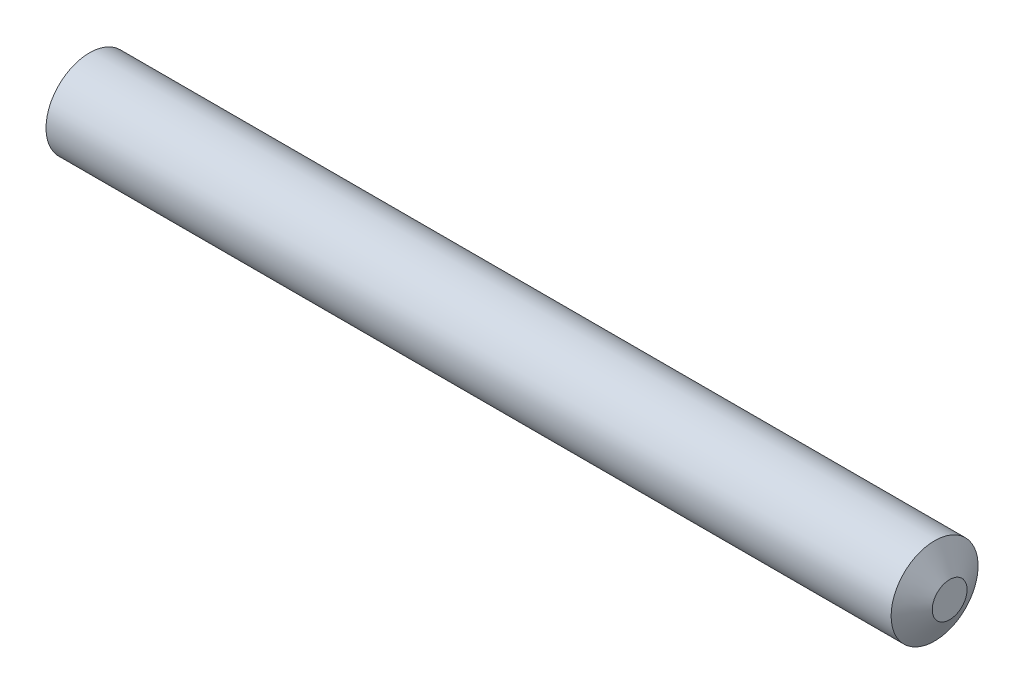
ISO-10303-21;
HEADER;
FILE_DESCRIPTION(('STEP AP214'),'2;1');
FILE_NAME('part.step','',(''),(''),'','','');
FILE_SCHEMA(('AUTOMOTIVE_DESIGN { 1 0 10303 214 1 1 1 1 }'));
ENDSEC;
DATA;
#1=APPLICATION_CONTEXT('core data for automotive mechanical design processes');
#2=APPLICATION_PROTOCOL_DEFINITION('international standard','automotive_design',2000,#1);
#3=PRODUCT_CONTEXT('',#1,'mechanical');
#4=PRODUCT('Part','Part','',(#3));
#5=PRODUCT_RELATED_PRODUCT_CATEGORY('part','',(#4));
#6=PRODUCT_DEFINITION_FORMATION('','',#4);
#7=PRODUCT_DEFINITION_CONTEXT('part definition',#1,'design');
#8=PRODUCT_DEFINITION('design','',#6,#7);
#9=PRODUCT_DEFINITION_SHAPE('','',#8);
#10=(LENGTH_UNIT() NAMED_UNIT(*) SI_UNIT(.MILLI.,.METRE.));
#11=(NAMED_UNIT(*) PLANE_ANGLE_UNIT() SI_UNIT($,.RADIAN.));
#12=(NAMED_UNIT(*) SI_UNIT($,.STERADIAN.) SOLID_ANGLE_UNIT());
#13=UNCERTAINTY_MEASURE_WITH_UNIT(LENGTH_MEASURE(1.E-05),#10,'distance_accuracy_value','');
#14=(GEOMETRIC_REPRESENTATION_CONTEXT(3) GLOBAL_UNCERTAINTY_ASSIGNED_CONTEXT((#13)) GLOBAL_UNIT_ASSIGNED_CONTEXT((#10,
#11,#12)) REPRESENTATION_CONTEXT('',''));
#15=CARTESIAN_POINT('',(0.,0.,0.));
#16=DIRECTION('',(0.,0.,1.));
#17=DIRECTION('',(1.,0.,0.));
#18=AXIS2_PLACEMENT_3D('',#15,#16,#17);
#19=CARTESIAN_POINT('',(0.,0.,0.));
#20=DIRECTION('',(-1.,0.,0.));
#21=DIRECTION('',(0.,0.,1.));
#22=AXIS2_PLACEMENT_3D('',#19,#20,#21);
#23=PLANE('',#22);
#24=CARTESIAN_POINT('',(0.,0.,0.));
#25=DIRECTION('',(-1.,0.,0.));
#26=DIRECTION('',(0.,0.,1.));
#27=AXIS2_PLACEMENT_3D('',#24,#25,#26);
#28=CIRCLE('',#27,0.774000000000001);
#29=CARTESIAN_POINT('',(0.,0.,0.774000000000001));
#30=VERTEX_POINT('',#29);
#31=EDGE_CURVE('E134',#30,#30,#28,.T.);
#32=ORIENTED_EDGE('',*,*,#31,.T.);
#33=EDGE_LOOP('',(#32));
#34=FACE_BOUND('',#33,.T.);
#35=DIRECTION('',(0.,0.,-1.));
#36=VECTOR('',#35,1.);
#37=CARTESIAN_POINT('',(0.,0.450000000000003,0.259807621135329));
#38=LINE('',#37,#36);
#39=CARTESIAN_POINT('',(0.,0.450000000000003,0.259807621135329));
#40=VERTEX_POINT('',#39);
#41=CARTESIAN_POINT('',(0.,0.450000000000003,-0.259807621135334));
#42=VERTEX_POINT('',#41);
#43=EDGE_CURVE('E125',#40,#42,#38,.T.);
#44=ORIENTED_EDGE('',*,*,#43,.F.);
#45=DIRECTION('',(0.,-0.866025403784439,0.5));
#46=VECTOR('',#45,1.);
#47=CARTESIAN_POINT('',(0.,0.450000000000003,0.259807621135329));
#48=LINE('',#47,#46);
#49=CARTESIAN_POINT('',(0.,0.,0.51961524227066));
#50=VERTEX_POINT('',#49);
#51=EDGE_CURVE('E47',#40,#50,#48,.T.);
#52=ORIENTED_EDGE('',*,*,#51,.T.);
#53=DIRECTION('',(0.,0.866025403784439,0.5));
#54=VECTOR('',#53,1.);
#55=CARTESIAN_POINT('',(0.,-0.449999999999997,0.259807621135329));
#56=LINE('',#55,#54);
#57=CARTESIAN_POINT('',(0.,-0.449999999999997,0.259807621135329));
#58=VERTEX_POINT('',#57);
#59=EDGE_CURVE('E116',#58,#50,#56,.T.);
#60=ORIENTED_EDGE('',*,*,#59,.F.);
#61=DIRECTION('',(0.,0.,-1.));
#62=VECTOR('',#61,1.);
#63=CARTESIAN_POINT('',(0.,-0.449999999999997,0.259807621135329));
#64=LINE('',#63,#62);
#65=CARTESIAN_POINT('',(0.,-0.449999999999997,-0.259807621135334));
#66=VERTEX_POINT('',#65);
#67=EDGE_CURVE('E119',#58,#66,#64,.T.);
#68=ORIENTED_EDGE('',*,*,#67,.T.);
#69=DIRECTION('',(0.,0.866025403784439,-0.5));
#70=VECTOR('',#69,1.);
#71=CARTESIAN_POINT('',(0.,-0.449999999999997,-0.259807621135334));
#72=LINE('',#71,#70);
#73=CARTESIAN_POINT('',(0.,0.,-0.519615242270666));
#74=VERTEX_POINT('',#73);
#75=EDGE_CURVE('E122',#66,#74,#72,.T.);
#76=ORIENTED_EDGE('',*,*,#75,.T.);
#77=DIRECTION('',(0.,-0.866025403784439,-0.5));
#78=VECTOR('',#77,1.);
#79=CARTESIAN_POINT('',(0.,0.450000000000003,-0.259807621135334));
#80=LINE('',#79,#78);
#81=EDGE_CURVE('E105',#42,#74,#80,.T.);
#82=ORIENTED_EDGE('',*,*,#81,.F.);
#83=EDGE_LOOP('',(#44,#52,#60,#68,#76,#82));
#84=FACE_BOUND('',#83,.T.);
#85=ADVANCED_FACE('F32',(#34,#84),#23,.T.);
#86=CARTESIAN_POINT('',(25.,0.5,0.));
#87=DIRECTION('',(1.,0.,0.));
#88=DIRECTION('',(0.,0.,-1.));
#89=AXIS2_PLACEMENT_3D('',#86,#87,#88);
#90=PLANE('',#89);
#91=CARTESIAN_POINT('',(25.,0.,0.));
#92=DIRECTION('',(-1.,0.,0.));
#93=DIRECTION('',(0.,0.,1.));
#94=AXIS2_PLACEMENT_3D('',#91,#92,#93);
#95=CIRCLE('',#94,0.5);
#96=CARTESIAN_POINT('',(25.,0.,0.5));
#97=VERTEX_POINT('',#96);
#98=EDGE_CURVE('E11',#97,#97,#95,.T.);
#99=ORIENTED_EDGE('',*,*,#98,.F.);
#100=EDGE_LOOP('',(#99));
#101=FACE_BOUND('',#100,.T.);
#102=ADVANCED_FACE('F34',(#101),#90,.T.);
#103=CARTESIAN_POINT('',(24.5669872981078,0.,0.));
#104=DIRECTION('',(-1.,0.,0.));
#105=DIRECTION('',(0.,0.,1.));
#106=AXIS2_PLACEMENT_3D('',#103,#104,#105);
#107=CONICAL_SURFACE('',#106,1.25,1.04719755119661);
#108=ORIENTED_EDGE('',*,*,#98,.T.);
#109=EDGE_LOOP('',(#108));
#110=FACE_BOUND('',#109,.T.);
#111=CARTESIAN_POINT('',(24.5669872981078,0.,0.));
#112=DIRECTION('',(-1.,0.,0.));
#113=DIRECTION('',(0.,0.,1.));
#114=AXIS2_PLACEMENT_3D('',#111,#112,#113);
#115=CIRCLE('',#114,1.25);
#116=CARTESIAN_POINT('',(24.5669872981078,0.,1.25));
#117=VERTEX_POINT('',#116);
#118=EDGE_CURVE('E40',#117,#117,#115,.T.);
#119=ORIENTED_EDGE('',*,*,#118,.F.);
#120=EDGE_LOOP('',(#119));
#121=FACE_BOUND('',#120,.T.);
#122=ADVANCED_FACE('F145',(#110,#121),#107,.T.);
#123=CARTESIAN_POINT('',(-12.7,0.,0.));
#124=DIRECTION('',(-1.,0.,0.));
#125=DIRECTION('',(0.,0.,1.));
#126=AXIS2_PLACEMENT_3D('',#123,#124,#125);
#127=CYLINDRICAL_SURFACE('',#126,1.25);
#128=ORIENTED_EDGE('',*,*,#118,.T.);
#129=EDGE_LOOP('',(#128));
#130=FACE_BOUND('',#129,.T.);
#131=CARTESIAN_POINT('',(0.274818728134238,0.,0.));
#132=DIRECTION('',(-1.,0.,0.));
#133=DIRECTION('',(0.,0.,1.));
#134=AXIS2_PLACEMENT_3D('',#131,#132,#133);
#135=CIRCLE('',#134,1.25);
#136=CARTESIAN_POINT('',(0.274818728134238,0.,1.25));
#137=VERTEX_POINT('',#136);
#138=EDGE_CURVE('E137',#137,#137,#135,.T.);
#139=ORIENTED_EDGE('',*,*,#138,.F.);
#140=EDGE_LOOP('',(#139));
#141=FACE_BOUND('',#140,.T.);
#142=ADVANCED_FACE('F142',(#130,#141),#127,.T.);
#143=CARTESIAN_POINT('',(0.,0.,0.));
#144=DIRECTION('',(1.,0.,0.));
#145=DIRECTION('',(0.,0.,-1.));
#146=AXIS2_PLACEMENT_3D('',#143,#144,#145);
#147=CONICAL_SURFACE('',#146,0.774000000000001,1.04719755119663);
#148=ORIENTED_EDGE('',*,*,#138,.T.);
#149=EDGE_LOOP('',(#148));
#150=FACE_BOUND('',#149,.T.);
#151=ORIENTED_EDGE('',*,*,#31,.F.);
#152=EDGE_LOOP('',(#151));
#153=FACE_BOUND('',#152,.T.);
#154=ADVANCED_FACE('F152',(#150,#153),#147,.T.);
#155=CARTESIAN_POINT('',(0.6,0.450000000000003,0.259807621135329));
#156=DIRECTION('',(0.,-0.499999999999999,-0.866025403784439));
#157=DIRECTION('',(0.,0.866025403784439,-0.5));
#158=AXIS2_PLACEMENT_3D('',#155,#156,#157);
#159=PLANE('',#158);
#160=ORIENTED_EDGE('',*,*,#51,.F.);
#161=DIRECTION('',(-1.,0.,0.));
#162=VECTOR('',#161,1.);
#163=CARTESIAN_POINT('',(0.6,0.450000000000003,0.259807621135329));
#164=LINE('',#163,#162);
#165=CARTESIAN_POINT('',(0.6,0.450000000000003,0.259807621135329));
#166=VERTEX_POINT('',#165);
#167=EDGE_CURVE('E52',#166,#40,#164,.T.);
#168=ORIENTED_EDGE('',*,*,#167,.F.);
#169=DIRECTION('',(0.,-0.866025403784439,0.5));
#170=VECTOR('',#169,1.);
#171=CARTESIAN_POINT('',(0.6,0.450000000000003,0.259807621135329));
#172=LINE('',#171,#170);
#173=CARTESIAN_POINT('',(0.6,0.,0.51961524227066));
#174=VERTEX_POINT('',#173);
#175=EDGE_CURVE('E79',#166,#174,#172,.T.);
#176=ORIENTED_EDGE('',*,*,#175,.T.);
#177=DIRECTION('',(-1.,0.,0.));
#178=VECTOR('',#177,1.);
#179=CARTESIAN_POINT('',(0.6,0.,0.51961524227066));
#180=LINE('',#179,#178);
#181=EDGE_CURVE('E132',#174,#50,#180,.T.);
#182=ORIENTED_EDGE('',*,*,#181,.T.);
#183=EDGE_LOOP('',(#160,#168,#176,#182));
#184=FACE_BOUND('',#183,.T.);
#185=ADVANCED_FACE('F163',(#184),#159,.T.);
#186=CARTESIAN_POINT('',(0.6,-0.449999999999997,0.259807621135329));
#187=DIRECTION('',(0.,-0.5,0.866025403784439));
#188=DIRECTION('',(0.,-0.866025403784439,-0.5));
#189=AXIS2_PLACEMENT_3D('',#186,#187,#188);
#190=PLANE('',#189);
#191=ORIENTED_EDGE('',*,*,#59,.T.);
#192=ORIENTED_EDGE('',*,*,#181,.F.);
#193=DIRECTION('',(0.,0.866025403784439,0.5));
#194=VECTOR('',#193,1.);
#195=CARTESIAN_POINT('',(0.6,-0.449999999999997,0.259807621135329));
#196=LINE('',#195,#194);
#197=CARTESIAN_POINT('',(0.6,-0.449999999999997,0.259807621135329));
#198=VERTEX_POINT('',#197);
#199=EDGE_CURVE('E263',#198,#174,#196,.T.);
#200=ORIENTED_EDGE('',*,*,#199,.F.);
#201=DIRECTION('',(-1.,0.,0.));
#202=VECTOR('',#201,1.);
#203=CARTESIAN_POINT('',(0.6,-0.449999999999997,0.259807621135329));
#204=LINE('',#203,#202);
#205=EDGE_CURVE('E130',#198,#58,#204,.T.);
#206=ORIENTED_EDGE('',*,*,#205,.T.);
#207=EDGE_LOOP('',(#191,#192,#200,#206));
#208=FACE_BOUND('',#207,.T.);
#209=ADVANCED_FACE('F170',(#208),#190,.F.);
#210=CARTESIAN_POINT('',(0.6,-0.449999999999997,0.259807621135329));
#211=DIRECTION('',(0.,1.,0.));
#212=DIRECTION('',(0.,0.,1.));
#213=AXIS2_PLACEMENT_3D('',#210,#211,#212);
#214=PLANE('',#213);
#215=ORIENTED_EDGE('',*,*,#67,.F.);
#216=ORIENTED_EDGE('',*,*,#205,.F.);
#217=DIRECTION('',(0.,0.,-1.));
#218=VECTOR('',#217,1.);
#219=CARTESIAN_POINT('',(0.6,-0.449999999999997,0.259807621135329));
#220=LINE('',#219,#218);
#221=CARTESIAN_POINT('',(0.6,-0.449999999999997,-0.259807621135334));
#222=VERTEX_POINT('',#221);
#223=EDGE_CURVE('E100',#198,#222,#220,.T.);
#224=ORIENTED_EDGE('',*,*,#223,.T.);
#225=DIRECTION('',(-1.,0.,0.));
#226=VECTOR('',#225,1.);
#227=CARTESIAN_POINT('',(0.6,-0.449999999999997,-0.259807621135334));
#228=LINE('',#227,#226);
#229=EDGE_CURVE('E95',#222,#66,#228,.T.);
#230=ORIENTED_EDGE('',*,*,#229,.T.);
#231=EDGE_LOOP('',(#215,#216,#224,#230));
#232=FACE_BOUND('',#231,.T.);
#233=ADVANCED_FACE('F177',(#232),#214,.T.);
#234=CARTESIAN_POINT('',(0.6,-0.449999999999997,-0.259807621135334));
#235=DIRECTION('',(0.,0.5,0.866025403784439));
#236=DIRECTION('',(0.,-0.866025403784439,0.5));
#237=AXIS2_PLACEMENT_3D('',#234,#235,#236);
#238=PLANE('',#237);
#239=ORIENTED_EDGE('',*,*,#75,.F.);
#240=ORIENTED_EDGE('',*,*,#229,.F.);
#241=DIRECTION('',(0.,0.866025403784439,-0.5));
#242=VECTOR('',#241,1.);
#243=CARTESIAN_POINT('',(0.6,-0.449999999999997,-0.259807621135334));
#244=LINE('',#243,#242);
#245=CARTESIAN_POINT('',(0.6,0.,-0.519615242270666));
#246=VERTEX_POINT('',#245);
#247=EDGE_CURVE('E90',#222,#246,#244,.T.);
#248=ORIENTED_EDGE('',*,*,#247,.T.);
#249=DIRECTION('',(-1.,0.,0.));
#250=VECTOR('',#249,1.);
#251=CARTESIAN_POINT('',(0.6,0.,-0.519615242270666));
#252=LINE('',#251,#250);
#253=EDGE_CURVE('E94',#246,#74,#252,.T.);
#254=ORIENTED_EDGE('',*,*,#253,.T.);
#255=EDGE_LOOP('',(#239,#240,#248,#254));
#256=FACE_BOUND('',#255,.T.);
#257=ADVANCED_FACE('F93',(#256),#238,.T.);
#258=CARTESIAN_POINT('',(0.6,0.450000000000003,-0.259807621135334));
#259=DIRECTION('',(0.,0.5,-0.866025403784439));
#260=DIRECTION('',(0.,0.866025403784439,0.5));
#261=AXIS2_PLACEMENT_3D('',#258,#259,#260);
#262=PLANE('',#261);
#263=ORIENTED_EDGE('',*,*,#81,.T.);
#264=ORIENTED_EDGE('',*,*,#253,.F.);
#265=DIRECTION('',(0.,-0.866025403784439,-0.5));
#266=VECTOR('',#265,1.);
#267=CARTESIAN_POINT('',(0.6,0.450000000000003,-0.259807621135334));
#268=LINE('',#267,#266);
#269=CARTESIAN_POINT('',(0.6,0.450000000000003,-0.259807621135334));
#270=VERTEX_POINT('',#269);
#271=EDGE_CURVE('E99',#270,#246,#268,.T.);
#272=ORIENTED_EDGE('',*,*,#271,.F.);
#273=DIRECTION('',(-1.,0.,0.));
#274=VECTOR('',#273,1.);
#275=CARTESIAN_POINT('',(0.6,0.450000000000003,-0.259807621135334));
#276=LINE('',#275,#274);
#277=EDGE_CURVE('E75',#270,#42,#276,.T.);
#278=ORIENTED_EDGE('',*,*,#277,.T.);
#279=EDGE_LOOP('',(#263,#264,#272,#278));
#280=FACE_BOUND('',#279,.T.);
#281=ADVANCED_FACE('F102',(#280),#262,.F.);
#282=CARTESIAN_POINT('',(0.6,0.450000000000003,0.259807621135329));
#283=DIRECTION('',(0.,1.,0.));
#284=DIRECTION('',(0.,0.,1.));
#285=AXIS2_PLACEMENT_3D('',#282,#283,#284);
#286=PLANE('',#285);
#287=ORIENTED_EDGE('',*,*,#43,.T.);
#288=ORIENTED_EDGE('',*,*,#277,.F.);
#289=DIRECTION('',(0.,0.,-1.));
#290=VECTOR('',#289,1.);
#291=CARTESIAN_POINT('',(0.6,0.450000000000003,0.259807621135329));
#292=LINE('',#291,#290);
#293=EDGE_CURVE('E110',#166,#270,#292,.T.);
#294=ORIENTED_EDGE('',*,*,#293,.F.);
#295=ORIENTED_EDGE('',*,*,#167,.T.);
#296=EDGE_LOOP('',(#287,#288,#294,#295));
#297=FACE_BOUND('',#296,.T.);
#298=ADVANCED_FACE('F189',(#297),#286,.F.);
#299=CARTESIAN_POINT('',(0.6,0.450000000000003,0.259807621135329));
#300=DIRECTION('',(1.,0.,0.));
#301=DIRECTION('',(0.,0.,-1.));
#302=AXIS2_PLACEMENT_3D('',#299,#300,#301);
#303=PLANE('',#302);
#304=ORIENTED_EDGE('',*,*,#175,.F.);
#305=ORIENTED_EDGE('',*,*,#293,.T.);
#306=ORIENTED_EDGE('',*,*,#271,.T.);
#307=ORIENTED_EDGE('',*,*,#247,.F.);
#308=ORIENTED_EDGE('',*,*,#223,.F.);
#309=ORIENTED_EDGE('',*,*,#199,.T.);
#310=EDGE_LOOP('',(#304,#305,#306,#307,#308,#309));
#311=FACE_BOUND('',#310,.T.);
#312=ADVANCED_FACE('F108',(#311),#303,.F.);
#313=CLOSED_SHELL('',(#85,#102,#122,#142,#154,#185,#209,#233,#257,#281,#298,#312));
#314=MANIFOLD_SOLID_BREP('B2',#313);
#315=ADVANCED_BREP_SHAPE_REPRESENTATION('',(#18,#314),#14);
#316=SHAPE_DEFINITION_REPRESENTATION(#9,#315);
ENDSEC;
END-ISO-10303-21;
